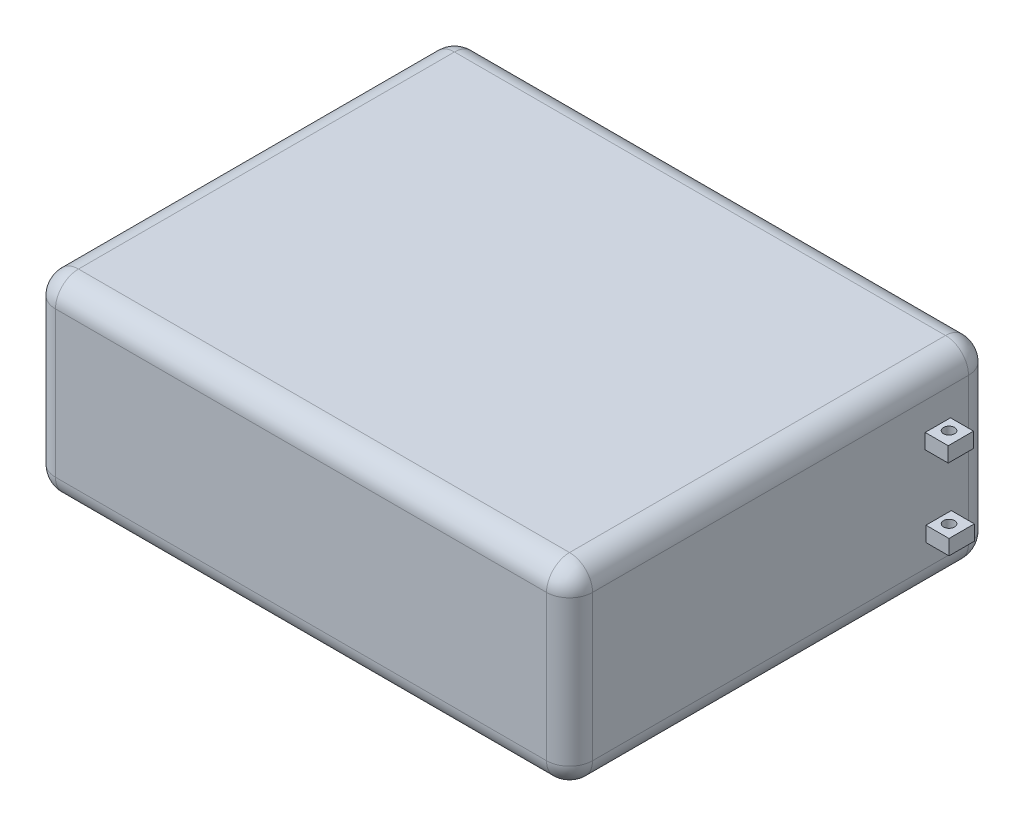
ISO-10303-21;
HEADER;
FILE_DESCRIPTION(('STEP AP214'),'2;1');
FILE_NAME('part.step','',(''),(''),'','','');
FILE_SCHEMA(('AUTOMOTIVE_DESIGN { 1 0 10303 214 1 1 1 1 }'));
ENDSEC;
DATA;
#1=APPLICATION_CONTEXT('core data for automotive mechanical design processes');
#2=APPLICATION_PROTOCOL_DEFINITION('international standard','automotive_design',2000,#1);
#3=PRODUCT_CONTEXT('',#1,'mechanical');
#4=PRODUCT('Part','Part','',(#3));
#5=PRODUCT_RELATED_PRODUCT_CATEGORY('part','',(#4));
#6=PRODUCT_DEFINITION_FORMATION('','',#4);
#7=PRODUCT_DEFINITION_CONTEXT('part definition',#1,'design');
#8=PRODUCT_DEFINITION('design','',#6,#7);
#9=PRODUCT_DEFINITION_SHAPE('','',#8);
#10=(LENGTH_UNIT() NAMED_UNIT(*) SI_UNIT(.MILLI.,.METRE.));
#11=(NAMED_UNIT(*) PLANE_ANGLE_UNIT() SI_UNIT($,.RADIAN.));
#12=(NAMED_UNIT(*) SI_UNIT($,.STERADIAN.) SOLID_ANGLE_UNIT());
#13=UNCERTAINTY_MEASURE_WITH_UNIT(LENGTH_MEASURE(1.E-05),#10,'distance_accuracy_value','');
#14=(GEOMETRIC_REPRESENTATION_CONTEXT(3) GLOBAL_UNCERTAINTY_ASSIGNED_CONTEXT((#13)) GLOBAL_UNIT_ASSIGNED_CONTEXT((#10,
#11,#12)) REPRESENTATION_CONTEXT('',''));
#15=CARTESIAN_POINT('',(0.,0.,0.));
#16=DIRECTION('',(0.,0.,1.));
#17=DIRECTION('',(1.,0.,0.));
#18=AXIS2_PLACEMENT_3D('',#15,#16,#17);
#19=CARTESIAN_POINT('',(35.,25.,-27.5));
#20=DIRECTION('',(-1.,0.,0.));
#21=DIRECTION('',(0.,0.,1.));
#22=AXIS2_PLACEMENT_3D('',#19,#20,#21);
#23=PLANE('',#22);
#24=DIRECTION('',(0.,1.,0.));
#25=VECTOR('',#24,1.);
#26=CARTESIAN_POINT('',(35.,18.3797730421074,-22.1523028209212));
#27=LINE('',#26,#25);
#28=CARTESIAN_POINT('',(35.,16.4198486947383,-22.1523028209212));
#29=VERTEX_POINT('',#28);
#30=CARTESIAN_POINT('',(35.,18.3797730421074,-22.1523028209213));
#31=VERTEX_POINT('',#30);
#32=EDGE_CURVE('E197',#29,#31,#27,.T.);
#33=ORIENTED_EDGE('',*,*,#32,.F.);
#34=DIRECTION('',(0.,0.,-1.));
#35=VECTOR('',#34,1.);
#36=CARTESIAN_POINT('',(35.,16.4198486947383,-18.8513776042997));
#37=LINE('',#36,#35);
#38=CARTESIAN_POINT('',(35.,16.4198486947383,-18.8513776042997));
#39=VERTEX_POINT('',#38);
#40=EDGE_CURVE('E210',#39,#29,#37,.T.);
#41=ORIENTED_EDGE('',*,*,#40,.F.);
#42=DIRECTION('',(0.,-1.,0.));
#43=VECTOR('',#42,1.);
#44=CARTESIAN_POINT('',(35.,18.3797730421074,-18.8513776042997));
#45=LINE('',#44,#43);
#46=CARTESIAN_POINT('',(35.,18.3797730421074,-18.8513776042997));
#47=VERTEX_POINT('',#46);
#48=EDGE_CURVE('E219',#47,#39,#45,.T.);
#49=ORIENTED_EDGE('',*,*,#48,.F.);
#50=DIRECTION('',(0.,0.,1.));
#51=VECTOR('',#50,1.);
#52=CARTESIAN_POINT('',(35.,18.3797730421074,-18.8513776042997));
#53=LINE('',#52,#51);
#54=EDGE_CURVE('E200',#31,#47,#53,.T.);
#55=ORIENTED_EDGE('',*,*,#54,.F.);
#56=EDGE_LOOP('',(#33,#41,#49,#55));
#57=FACE_BOUND('',#56,.T.);
#58=DIRECTION('',(0.,0.,-1.));
#59=VECTOR('',#58,1.);
#60=CARTESIAN_POINT('',(35.,22.,27.5));
#61=LINE('',#60,#59);
#62=CARTESIAN_POINT('',(35.,22.,-24.5));
#63=VERTEX_POINT('',#62);
#64=CARTESIAN_POINT('',(35.,22.,24.5));
#65=VERTEX_POINT('',#64);
#66=EDGE_CURVE('E259',#63,#65,#61,.F.);
#67=ORIENTED_EDGE('',*,*,#66,.T.);
#68=DIRECTION('',(0.,-1.,0.));
#69=VECTOR('',#68,1.);
#70=CARTESIAN_POINT('',(35.,25.,24.5));
#71=LINE('',#70,#69);
#72=CARTESIAN_POINT('',(35.,3.,24.5));
#73=VERTEX_POINT('',#72);
#74=EDGE_CURVE('E261',#65,#73,#71,.T.);
#75=ORIENTED_EDGE('',*,*,#74,.T.);
#76=DIRECTION('',(0.,0.,-1.));
#77=VECTOR('',#76,1.);
#78=CARTESIAN_POINT('',(35.,3.,-27.5));
#79=LINE('',#78,#77);
#80=CARTESIAN_POINT('',(35.,3.,-24.5));
#81=VERTEX_POINT('',#80);
#82=EDGE_CURVE('E255',#73,#81,#79,.T.);
#83=ORIENTED_EDGE('',*,*,#82,.T.);
#84=DIRECTION('',(0.,-1.,0.));
#85=VECTOR('',#84,1.);
#86=CARTESIAN_POINT('',(35.,25.,-24.5));
#87=LINE('',#86,#85);
#88=EDGE_CURVE('E257',#81,#63,#87,.F.);
#89=ORIENTED_EDGE('',*,*,#88,.T.);
#90=EDGE_LOOP('',(#67,#75,#83,#89));
#91=FACE_BOUND('',#90,.T.);
#92=DIRECTION('',(0.,1.,0.));
#93=VECTOR('',#92,1.);
#94=CARTESIAN_POINT('',(35.,7.85807391412618,-22.2554567339407));
#95=LINE('',#94,#93);
#96=CARTESIAN_POINT('',(35.,5.89814956675713,-22.2554567339407));
#97=VERTEX_POINT('',#96);
#98=CARTESIAN_POINT('',(35.,7.85807391412618,-22.2554567339407));
#99=VERTEX_POINT('',#98);
#100=EDGE_CURVE('E196',#97,#99,#95,.T.);
#101=ORIENTED_EDGE('',*,*,#100,.F.);
#102=DIRECTION('',(0.,0.,-1.));
#103=VECTOR('',#102,1.);
#104=CARTESIAN_POINT('',(35.,5.89814956675713,-18.9545315173191));
#105=LINE('',#104,#103);
#106=CARTESIAN_POINT('',(35.,5.89814956675713,-18.9545315173191));
#107=VERTEX_POINT('',#106);
#108=EDGE_CURVE('E193',#107,#97,#105,.T.);
#109=ORIENTED_EDGE('',*,*,#108,.F.);
#110=DIRECTION('',(0.,-1.,0.));
#111=VECTOR('',#110,1.);
#112=CARTESIAN_POINT('',(35.,7.85807391412618,-18.9545315173191));
#113=LINE('',#112,#111);
#114=CARTESIAN_POINT('',(35.,7.85807391412618,-18.9545315173191));
#115=VERTEX_POINT('',#114);
#116=EDGE_CURVE('E59',#115,#107,#113,.T.);
#117=ORIENTED_EDGE('',*,*,#116,.F.);
#118=DIRECTION('',(0.,0.,1.));
#119=VECTOR('',#118,1.);
#120=CARTESIAN_POINT('',(35.,7.85807391412618,-18.9545315173191));
#121=LINE('',#120,#119);
#122=EDGE_CURVE('E54',#99,#115,#121,.T.);
#123=ORIENTED_EDGE('',*,*,#122,.F.);
#124=EDGE_LOOP('',(#101,#109,#117,#123));
#125=FACE_BOUND('',#124,.T.);
#126=ADVANCED_FACE('F37',(#57,#91,#125),#23,.F.);
#127=CARTESIAN_POINT('',(-35.,25.,-27.5));
#128=DIRECTION('',(0.,0.,1.));
#129=DIRECTION('',(1.,0.,0.));
#130=AXIS2_PLACEMENT_3D('',#127,#128,#129);
#131=PLANE('',#130);
#132=DIRECTION('',(-1.,0.,0.));
#133=VECTOR('',#132,1.);
#134=CARTESIAN_POINT('',(35.,22.,-27.5));
#135=LINE('',#134,#133);
#136=CARTESIAN_POINT('',(-32.,22.,-27.5));
#137=VERTEX_POINT('',#136);
#138=CARTESIAN_POINT('',(32.,22.,-27.5));
#139=VERTEX_POINT('',#138);
#140=EDGE_CURVE('E268',#137,#139,#135,.F.);
#141=ORIENTED_EDGE('',*,*,#140,.T.);
#142=DIRECTION('',(0.,-1.,0.));
#143=VECTOR('',#142,1.);
#144=CARTESIAN_POINT('',(32.,25.,-27.5));
#145=LINE('',#144,#143);
#146=CARTESIAN_POINT('',(32.,3.,-27.5));
#147=VERTEX_POINT('',#146);
#148=EDGE_CURVE('E270',#139,#147,#145,.T.);
#149=ORIENTED_EDGE('',*,*,#148,.T.);
#150=DIRECTION('',(-1.,0.,0.));
#151=VECTOR('',#150,1.);
#152=CARTESIAN_POINT('',(-35.,3.,-27.5));
#153=LINE('',#152,#151);
#154=CARTESIAN_POINT('',(-32.,3.,-27.5));
#155=VERTEX_POINT('',#154);
#156=EDGE_CURVE('E264',#147,#155,#153,.T.);
#157=ORIENTED_EDGE('',*,*,#156,.T.);
#158=DIRECTION('',(0.,-1.,0.));
#159=VECTOR('',#158,1.);
#160=CARTESIAN_POINT('',(-32.,25.,-27.5));
#161=LINE('',#160,#159);
#162=EDGE_CURVE('E266',#155,#137,#161,.F.);
#163=ORIENTED_EDGE('',*,*,#162,.T.);
#164=EDGE_LOOP('',(#141,#149,#157,#163));
#165=FACE_BOUND('',#164,.T.);
#166=ADVANCED_FACE('F395',(#165),#131,.F.);
#167=CARTESIAN_POINT('',(-35.,25.,-27.5));
#168=DIRECTION('',(1.,0.,0.));
#169=DIRECTION('',(0.,0.,-1.));
#170=AXIS2_PLACEMENT_3D('',#167,#168,#169);
#171=PLANE('',#170);
#172=DIRECTION('',(0.,0.,1.));
#173=VECTOR('',#172,1.);
#174=CARTESIAN_POINT('',(-35.,22.,-27.5));
#175=LINE('',#174,#173);
#176=CARTESIAN_POINT('',(-35.,22.,24.5));
#177=VERTEX_POINT('',#176);
#178=CARTESIAN_POINT('',(-35.,22.,-24.5));
#179=VERTEX_POINT('',#178);
#180=EDGE_CURVE('E277',#177,#179,#175,.F.);
#181=ORIENTED_EDGE('',*,*,#180,.T.);
#182=DIRECTION('',(0.,-1.,0.));
#183=VECTOR('',#182,1.);
#184=CARTESIAN_POINT('',(-35.,25.,-24.5));
#185=LINE('',#184,#183);
#186=CARTESIAN_POINT('',(-35.,3.,-24.5));
#187=VERTEX_POINT('',#186);
#188=EDGE_CURVE('E279',#179,#187,#185,.T.);
#189=ORIENTED_EDGE('',*,*,#188,.T.);
#190=DIRECTION('',(0.,0.,1.));
#191=VECTOR('',#190,1.);
#192=CARTESIAN_POINT('',(-35.,3.,-27.5));
#193=LINE('',#192,#191);
#194=CARTESIAN_POINT('',(-35.,3.,24.5));
#195=VERTEX_POINT('',#194);
#196=EDGE_CURVE('E273',#187,#195,#193,.T.);
#197=ORIENTED_EDGE('',*,*,#196,.T.);
#198=DIRECTION('',(0.,-1.,0.));
#199=VECTOR('',#198,1.);
#200=CARTESIAN_POINT('',(-35.,25.,24.5));
#201=LINE('',#200,#199);
#202=EDGE_CURVE('E275',#195,#177,#201,.F.);
#203=ORIENTED_EDGE('',*,*,#202,.T.);
#204=EDGE_LOOP('',(#181,#189,#197,#203));
#205=FACE_BOUND('',#204,.T.);
#206=ADVANCED_FACE('F367',(#205),#171,.F.);
#207=CARTESIAN_POINT('',(-35.,25.,27.5));
#208=DIRECTION('',(0.,0.,-1.));
#209=DIRECTION('',(-1.,0.,0.));
#210=AXIS2_PLACEMENT_3D('',#207,#208,#209);
#211=PLANE('',#210);
#212=DIRECTION('',(0.,-1.,0.));
#213=VECTOR('',#212,1.);
#214=CARTESIAN_POINT('',(32.,25.,27.5));
#215=LINE('',#214,#213);
#216=CARTESIAN_POINT('',(32.,3.,27.5));
#217=VERTEX_POINT('',#216);
#218=CARTESIAN_POINT('',(32.,22.,27.5));
#219=VERTEX_POINT('',#218);
#220=EDGE_CURVE('E250',#217,#219,#215,.F.);
#221=ORIENTED_EDGE('',*,*,#220,.T.);
#222=DIRECTION('',(1.,0.,0.));
#223=VECTOR('',#222,1.);
#224=CARTESIAN_POINT('',(-35.,22.,27.5));
#225=LINE('',#224,#223);
#226=CARTESIAN_POINT('',(-32.,22.,27.5));
#227=VERTEX_POINT('',#226);
#228=EDGE_CURVE('E252',#219,#227,#225,.F.);
#229=ORIENTED_EDGE('',*,*,#228,.T.);
#230=DIRECTION('',(0.,-1.,0.));
#231=VECTOR('',#230,1.);
#232=CARTESIAN_POINT('',(-32.,25.,27.5));
#233=LINE('',#232,#231);
#234=CARTESIAN_POINT('',(-32.,3.,27.5));
#235=VERTEX_POINT('',#234);
#236=EDGE_CURVE('E248',#227,#235,#233,.T.);
#237=ORIENTED_EDGE('',*,*,#236,.T.);
#238=DIRECTION('',(1.,0.,0.));
#239=VECTOR('',#238,1.);
#240=CARTESIAN_POINT('',(-35.,3.,27.5));
#241=LINE('',#240,#239);
#242=EDGE_CURVE('E246',#235,#217,#241,.T.);
#243=ORIENTED_EDGE('',*,*,#242,.T.);
#244=EDGE_LOOP('',(#221,#229,#237,#243));
#245=FACE_BOUND('',#244,.T.);
#246=ADVANCED_FACE('F768',(#245),#211,.F.);
#247=CARTESIAN_POINT('',(0.,25.,0.));
#248=DIRECTION('',(0.,1.,0.));
#249=DIRECTION('',(0.,0.,1.));
#250=AXIS2_PLACEMENT_3D('',#247,#248,#249);
#251=PLANE('',#250);
#252=DIRECTION('',(0.,0.,1.));
#253=VECTOR('',#252,1.);
#254=CARTESIAN_POINT('',(-32.,25.,27.5));
#255=LINE('',#254,#253);
#256=CARTESIAN_POINT('',(-32.,25.,-24.5));
#257=VERTEX_POINT('',#256);
#258=CARTESIAN_POINT('',(-32.,25.,24.5));
#259=VERTEX_POINT('',#258);
#260=EDGE_CURVE('E236',#257,#259,#255,.T.);
#261=ORIENTED_EDGE('',*,*,#260,.T.);
#262=DIRECTION('',(1.,0.,0.));
#263=VECTOR('',#262,1.);
#264=CARTESIAN_POINT('',(35.,25.,24.5));
#265=LINE('',#264,#263);
#266=CARTESIAN_POINT('',(32.,25.,24.5));
#267=VERTEX_POINT('',#266);
#268=EDGE_CURVE('E243',#259,#267,#265,.T.);
#269=ORIENTED_EDGE('',*,*,#268,.T.);
#270=DIRECTION('',(0.,0.,-1.));
#271=VECTOR('',#270,1.);
#272=CARTESIAN_POINT('',(32.,25.,-27.5));
#273=LINE('',#272,#271);
#274=CARTESIAN_POINT('',(32.,25.,-24.5));
#275=VERTEX_POINT('',#274);
#276=EDGE_CURVE('E241',#267,#275,#273,.T.);
#277=ORIENTED_EDGE('',*,*,#276,.T.);
#278=DIRECTION('',(-1.,0.,0.));
#279=VECTOR('',#278,1.);
#280=CARTESIAN_POINT('',(-35.,25.,-24.5));
#281=LINE('',#280,#279);
#282=EDGE_CURVE('E238',#275,#257,#281,.T.);
#283=ORIENTED_EDGE('',*,*,#282,.T.);
#284=EDGE_LOOP('',(#261,#269,#277,#283));
#285=FACE_BOUND('',#284,.T.);
#286=ADVANCED_FACE('F385',(#285),#251,.T.);
#287=CARTESIAN_POINT('',(0.,0.,0.));
#288=DIRECTION('',(0.,1.,0.));
#289=DIRECTION('',(0.,0.,1.));
#290=AXIS2_PLACEMENT_3D('',#287,#288,#289);
#291=PLANE('',#290);
#292=DIRECTION('',(0.,0.,1.));
#293=VECTOR('',#292,1.);
#294=CARTESIAN_POINT('',(-32.,0.,0.));
#295=LINE('',#294,#293);
#296=CARTESIAN_POINT('',(-32.,0.,24.5));
#297=VERTEX_POINT('',#296);
#298=CARTESIAN_POINT('',(-32.,0.,-24.5));
#299=VERTEX_POINT('',#298);
#300=EDGE_CURVE('E46',#297,#299,#295,.F.);
#301=ORIENTED_EDGE('',*,*,#300,.T.);
#302=DIRECTION('',(-1.,0.,0.));
#303=VECTOR('',#302,1.);
#304=CARTESIAN_POINT('',(0.,0.,-24.5));
#305=LINE('',#304,#303);
#306=CARTESIAN_POINT('',(32.,0.,-24.5));
#307=VERTEX_POINT('',#306);
#308=EDGE_CURVE('E11',#299,#307,#305,.F.);
#309=ORIENTED_EDGE('',*,*,#308,.T.);
#310=DIRECTION('',(0.,0.,-1.));
#311=VECTOR('',#310,1.);
#312=CARTESIAN_POINT('',(32.,0.,0.));
#313=LINE('',#312,#311);
#314=CARTESIAN_POINT('',(32.,0.,24.5));
#315=VERTEX_POINT('',#314);
#316=EDGE_CURVE('E282',#307,#315,#313,.F.);
#317=ORIENTED_EDGE('',*,*,#316,.T.);
#318=DIRECTION('',(1.,0.,0.));
#319=VECTOR('',#318,1.);
#320=CARTESIAN_POINT('',(0.,0.,24.5));
#321=LINE('',#320,#319);
#322=EDGE_CURVE('E284',#315,#297,#321,.F.);
#323=ORIENTED_EDGE('',*,*,#322,.T.);
#324=EDGE_LOOP('',(#301,#309,#317,#323));
#325=FACE_BOUND('',#324,.T.);
#326=ADVANCED_FACE('F407',(#325),#291,.F.);
#327=CARTESIAN_POINT('',(-35.,3.,-24.5));
#328=DIRECTION('',(-1.,0.,0.));
#329=DIRECTION('',(0.,0.,1.));
#330=AXIS2_PLACEMENT_3D('',#327,#328,#329);
#331=CYLINDRICAL_SURFACE('',#330,3.);
#332=CARTESIAN_POINT('',(-32.,3.,-24.5));
#333=DIRECTION('',(-1.,0.,0.));
#334=DIRECTION('',(0.,0.,1.));
#335=AXIS2_PLACEMENT_3D('',#332,#333,#334);
#336=CIRCLE('',#335,3.);
#337=EDGE_CURVE('E239',#155,#299,#336,.T.);
#338=ORIENTED_EDGE('',*,*,#337,.F.);
#339=ORIENTED_EDGE('',*,*,#156,.F.);
#340=CARTESIAN_POINT('',(32.,3.,-24.5));
#341=DIRECTION('',(1.,0.,0.));
#342=DIRECTION('',(0.,0.,-1.));
#343=AXIS2_PLACEMENT_3D('',#340,#341,#342);
#344=CIRCLE('',#343,3.);
#345=EDGE_CURVE('E348',#307,#147,#344,.T.);
#346=ORIENTED_EDGE('',*,*,#345,.F.);
#347=ORIENTED_EDGE('',*,*,#308,.F.);
#348=EDGE_LOOP('',(#338,#339,#346,#347));
#349=FACE_BOUND('',#348,.T.);
#350=ADVANCED_FACE('F39',(#349),#331,.T.);
#351=CARTESIAN_POINT('',(-32.,3.,-24.5));
#352=DIRECTION('',(0.,-1.,0.));
#353=DIRECTION('',(0.,0.,-1.));
#354=AXIS2_PLACEMENT_3D('',#351,#352,#353);
#355=SPHERICAL_SURFACE('',#354,3.);
#356=CARTESIAN_POINT('',(-32.,3.,-24.5));
#357=DIRECTION('',(0.,-1.,0.));
#358=DIRECTION('',(0.,0.,-1.));
#359=AXIS2_PLACEMENT_3D('',#356,#357,#358);
#360=CIRCLE('',#359,3.);
#361=EDGE_CURVE('E342',#155,#187,#360,.F.);
#362=ORIENTED_EDGE('',*,*,#361,.F.);
#363=ORIENTED_EDGE('',*,*,#337,.T.);
#364=CARTESIAN_POINT('',(-32.,3.,-24.5));
#365=DIRECTION('',(0.,0.,-1.));
#366=DIRECTION('',(-1.,0.,0.));
#367=AXIS2_PLACEMENT_3D('',#364,#365,#366);
#368=CIRCLE('',#367,3.);
#369=EDGE_CURVE('E345',#187,#299,#368,.F.);
#370=ORIENTED_EDGE('',*,*,#369,.F.);
#371=EDGE_LOOP('',(#362,#363,#370));
#372=FACE_BOUND('',#371,.T.);
#373=ADVANCED_FACE('F355',(#372),#355,.T.);
#374=CARTESIAN_POINT('',(32.,3.,-24.5));
#375=DIRECTION('',(0.,0.,-1.));
#376=DIRECTION('',(0.,1.,0.));
#377=AXIS2_PLACEMENT_3D('',#374,#375,#376);
#378=SPHERICAL_SURFACE('',#377,3.);
#379=CARTESIAN_POINT('',(32.,3.,-24.5));
#380=DIRECTION('',(0.,0.,-1.));
#381=DIRECTION('',(-1.,0.,0.));
#382=AXIS2_PLACEMENT_3D('',#379,#380,#381);
#383=CIRCLE('',#382,3.);
#384=EDGE_CURVE('E337',#307,#81,#383,.F.);
#385=ORIENTED_EDGE('',*,*,#384,.F.);
#386=ORIENTED_EDGE('',*,*,#345,.T.);
#387=CARTESIAN_POINT('',(32.,3.,-24.5));
#388=DIRECTION('',(0.,-1.,0.));
#389=DIRECTION('',(0.,0.,-1.));
#390=AXIS2_PLACEMENT_3D('',#387,#388,#389);
#391=CIRCLE('',#390,3.);
#392=EDGE_CURVE('E340',#81,#147,#391,.F.);
#393=ORIENTED_EDGE('',*,*,#392,.F.);
#394=EDGE_LOOP('',(#385,#386,#393));
#395=FACE_BOUND('',#394,.T.);
#396=ADVANCED_FACE('F405',(#395),#378,.T.);
#397=CARTESIAN_POINT('',(-32.,3.,-27.5));
#398=DIRECTION('',(0.,0.,1.));
#399=DIRECTION('',(1.,0.,0.));
#400=AXIS2_PLACEMENT_3D('',#397,#398,#399);
#401=CYLINDRICAL_SURFACE('',#400,3.);
#402=ORIENTED_EDGE('',*,*,#369,.T.);
#403=ORIENTED_EDGE('',*,*,#300,.F.);
#404=CARTESIAN_POINT('',(-32.,3.,24.5));
#405=DIRECTION('',(0.,0.,1.));
#406=DIRECTION('',(1.,0.,0.));
#407=AXIS2_PLACEMENT_3D('',#404,#405,#406);
#408=CIRCLE('',#407,3.);
#409=EDGE_CURVE('E331',#195,#297,#408,.T.);
#410=ORIENTED_EDGE('',*,*,#409,.F.);
#411=ORIENTED_EDGE('',*,*,#196,.F.);
#412=EDGE_LOOP('',(#402,#403,#410,#411));
#413=FACE_BOUND('',#412,.T.);
#414=ADVANCED_FACE('F362',(#413),#401,.T.);
#415=CARTESIAN_POINT('',(-32.,25.,-24.5));
#416=DIRECTION('',(0.,-1.,0.));
#417=DIRECTION('',(0.,0.,-1.));
#418=AXIS2_PLACEMENT_3D('',#415,#416,#417);
#419=CYLINDRICAL_SURFACE('',#418,3.);
#420=ORIENTED_EDGE('',*,*,#361,.T.);
#421=ORIENTED_EDGE('',*,*,#188,.F.);
#422=CARTESIAN_POINT('',(-32.,22.,-24.5));
#423=DIRECTION('',(0.,1.,0.));
#424=DIRECTION('',(0.,0.,1.));
#425=AXIS2_PLACEMENT_3D('',#422,#423,#424);
#426=CIRCLE('',#425,3.);
#427=EDGE_CURVE('E328',#137,#179,#426,.T.);
#428=ORIENTED_EDGE('',*,*,#427,.F.);
#429=ORIENTED_EDGE('',*,*,#162,.F.);
#430=EDGE_LOOP('',(#420,#421,#428,#429));
#431=FACE_BOUND('',#430,.T.);
#432=ADVANCED_FACE('F373',(#431),#419,.T.);
#433=CARTESIAN_POINT('',(0.,22.,-24.5));
#434=DIRECTION('',(1.,0.,0.));
#435=DIRECTION('',(0.,0.,-1.));
#436=AXIS2_PLACEMENT_3D('',#433,#434,#435);
#437=CYLINDRICAL_SURFACE('',#436,3.);
#438=CARTESIAN_POINT('',(32.,22.,-24.5));
#439=DIRECTION('',(1.,0.,0.));
#440=DIRECTION('',(0.,0.,-1.));
#441=AXIS2_PLACEMENT_3D('',#438,#439,#440);
#442=CIRCLE('',#441,3.);
#443=EDGE_CURVE('E322',#139,#275,#442,.T.);
#444=ORIENTED_EDGE('',*,*,#443,.F.);
#445=ORIENTED_EDGE('',*,*,#140,.F.);
#446=CARTESIAN_POINT('',(-32.,22.,-24.5));
#447=DIRECTION('',(-1.,0.,0.));
#448=DIRECTION('',(0.,0.,1.));
#449=AXIS2_PLACEMENT_3D('',#446,#447,#448);
#450=CIRCLE('',#449,3.);
#451=EDGE_CURVE('E325',#257,#137,#450,.T.);
#452=ORIENTED_EDGE('',*,*,#451,.F.);
#453=ORIENTED_EDGE('',*,*,#282,.F.);
#454=EDGE_LOOP('',(#444,#445,#452,#453));
#455=FACE_BOUND('',#454,.T.);
#456=ADVANCED_FACE('F392',(#455),#437,.T.);
#457=CARTESIAN_POINT('',(32.,25.,-24.5));
#458=DIRECTION('',(0.,-1.,0.));
#459=DIRECTION('',(0.,0.,-1.));
#460=AXIS2_PLACEMENT_3D('',#457,#458,#459);
#461=CYLINDRICAL_SURFACE('',#460,3.);
#462=ORIENTED_EDGE('',*,*,#392,.T.);
#463=ORIENTED_EDGE('',*,*,#148,.F.);
#464=CARTESIAN_POINT('',(32.,22.,-24.5));
#465=DIRECTION('',(0.,1.,0.));
#466=DIRECTION('',(0.,0.,1.));
#467=AXIS2_PLACEMENT_3D('',#464,#465,#466);
#468=CIRCLE('',#467,3.);
#469=EDGE_CURVE('E319',#63,#139,#468,.T.);
#470=ORIENTED_EDGE('',*,*,#469,.F.);
#471=ORIENTED_EDGE('',*,*,#88,.F.);
#472=EDGE_LOOP('',(#462,#463,#470,#471));
#473=FACE_BOUND('',#472,.T.);
#474=ADVANCED_FACE('F398',(#473),#461,.T.);
#475=CARTESIAN_POINT('',(32.,3.,-27.5));
#476=DIRECTION('',(0.,0.,-1.));
#477=DIRECTION('',(-1.,0.,0.));
#478=AXIS2_PLACEMENT_3D('',#475,#476,#477);
#479=CYLINDRICAL_SURFACE('',#478,3.);
#480=ORIENTED_EDGE('',*,*,#384,.T.);
#481=ORIENTED_EDGE('',*,*,#82,.F.);
#482=CARTESIAN_POINT('',(32.,3.,24.5));
#483=DIRECTION('',(0.,0.,1.));
#484=DIRECTION('',(1.,0.,0.));
#485=AXIS2_PLACEMENT_3D('',#482,#483,#484);
#486=CIRCLE('',#485,3.);
#487=EDGE_CURVE('E316',#315,#73,#486,.T.);
#488=ORIENTED_EDGE('',*,*,#487,.F.);
#489=ORIENTED_EDGE('',*,*,#316,.F.);
#490=EDGE_LOOP('',(#480,#481,#488,#489));
#491=FACE_BOUND('',#490,.T.);
#492=ADVANCED_FACE('F468',(#491),#479,.T.);
#493=CARTESIAN_POINT('',(-35.,3.,24.5));
#494=DIRECTION('',(1.,0.,0.));
#495=DIRECTION('',(0.,0.,-1.));
#496=AXIS2_PLACEMENT_3D('',#493,#494,#495);
#497=CYLINDRICAL_SURFACE('',#496,3.);
#498=CARTESIAN_POINT('',(-32.,3.,24.5));
#499=DIRECTION('',(-1.,0.,0.));
#500=DIRECTION('',(0.,0.,1.));
#501=AXIS2_PLACEMENT_3D('',#498,#499,#500);
#502=CIRCLE('',#501,3.);
#503=EDGE_CURVE('E334',#297,#235,#502,.T.);
#504=ORIENTED_EDGE('',*,*,#503,.F.);
#505=ORIENTED_EDGE('',*,*,#322,.F.);
#506=CARTESIAN_POINT('',(32.,3.,24.5));
#507=DIRECTION('',(1.,0.,0.));
#508=DIRECTION('',(0.,0.,-1.));
#509=AXIS2_PLACEMENT_3D('',#506,#507,#508);
#510=CIRCLE('',#509,3.);
#511=EDGE_CURVE('E313',#217,#315,#510,.T.);
#512=ORIENTED_EDGE('',*,*,#511,.F.);
#513=ORIENTED_EDGE('',*,*,#242,.F.);
#514=EDGE_LOOP('',(#504,#505,#512,#513));
#515=FACE_BOUND('',#514,.T.);
#516=ADVANCED_FACE('F464',(#515),#497,.T.);
#517=CARTESIAN_POINT('',(-32.,3.,24.5));
#518=DIRECTION('',(0.,-1.,0.));
#519=DIRECTION('',(0.,0.,-1.));
#520=AXIS2_PLACEMENT_3D('',#517,#518,#519);
#521=SPHERICAL_SURFACE('',#520,3.);
#522=ORIENTED_EDGE('',*,*,#409,.T.);
#523=ORIENTED_EDGE('',*,*,#503,.T.);
#524=CARTESIAN_POINT('',(-32.,3.,24.5));
#525=DIRECTION('',(0.,-1.,0.));
#526=DIRECTION('',(0.,0.,-1.));
#527=AXIS2_PLACEMENT_3D('',#524,#525,#526);
#528=CIRCLE('',#527,3.);
#529=EDGE_CURVE('E310',#195,#235,#528,.F.);
#530=ORIENTED_EDGE('',*,*,#529,.F.);
#531=EDGE_LOOP('',(#522,#523,#530));
#532=FACE_BOUND('',#531,.T.);
#533=ADVANCED_FACE('F461',(#532),#521,.T.);
#534=CARTESIAN_POINT('',(-32.,22.,-24.5));
#535=DIRECTION('',(0.,0.,-1.));
#536=DIRECTION('',(-1.,0.,0.));
#537=AXIS2_PLACEMENT_3D('',#534,#535,#536);
#538=SPHERICAL_SURFACE('',#537,3.);
#539=ORIENTED_EDGE('',*,*,#451,.T.);
#540=ORIENTED_EDGE('',*,*,#427,.T.);
#541=CARTESIAN_POINT('',(-32.,22.,-24.5));
#542=DIRECTION('',(0.,0.,-1.));
#543=DIRECTION('',(-1.,0.,0.));
#544=AXIS2_PLACEMENT_3D('',#541,#542,#543);
#545=CIRCLE('',#544,3.);
#546=EDGE_CURVE('E307',#257,#179,#545,.F.);
#547=ORIENTED_EDGE('',*,*,#546,.F.);
#548=EDGE_LOOP('',(#539,#540,#547));
#549=FACE_BOUND('',#548,.T.);
#550=ADVANCED_FACE('F376',(#549),#538,.T.);
#551=CARTESIAN_POINT('',(32.,22.,-24.5));
#552=DIRECTION('',(0.,0.,-1.));
#553=DIRECTION('',(-1.,0.,0.));
#554=AXIS2_PLACEMENT_3D('',#551,#552,#553);
#555=SPHERICAL_SURFACE('',#554,3.);
#556=ORIENTED_EDGE('',*,*,#469,.T.);
#557=ORIENTED_EDGE('',*,*,#443,.T.);
#558=CARTESIAN_POINT('',(32.,22.,-24.5));
#559=DIRECTION('',(0.,0.,-1.));
#560=DIRECTION('',(-1.,0.,0.));
#561=AXIS2_PLACEMENT_3D('',#558,#559,#560);
#562=CIRCLE('',#561,3.);
#563=EDGE_CURVE('E304',#63,#275,#562,.F.);
#564=ORIENTED_EDGE('',*,*,#563,.F.);
#565=EDGE_LOOP('',(#556,#557,#564));
#566=FACE_BOUND('',#565,.T.);
#567=ADVANCED_FACE('F454',(#566),#555,.T.);
#568=CARTESIAN_POINT('',(32.,3.,24.5));
#569=DIRECTION('',(0.,-1.,0.));
#570=DIRECTION('',(0.,0.,-1.));
#571=AXIS2_PLACEMENT_3D('',#568,#569,#570);
#572=SPHERICAL_SURFACE('',#571,3.);
#573=ORIENTED_EDGE('',*,*,#511,.T.);
#574=ORIENTED_EDGE('',*,*,#487,.T.);
#575=CARTESIAN_POINT('',(32.,3.,24.5));
#576=DIRECTION('',(0.,-1.,0.));
#577=DIRECTION('',(0.,0.,-1.));
#578=AXIS2_PLACEMENT_3D('',#575,#576,#577);
#579=CIRCLE('',#578,3.);
#580=EDGE_CURVE('E302',#217,#73,#579,.F.);
#581=ORIENTED_EDGE('',*,*,#580,.F.);
#582=EDGE_LOOP('',(#573,#574,#581));
#583=FACE_BOUND('',#582,.T.);
#584=ADVANCED_FACE('F450',(#583),#572,.T.);
#585=CARTESIAN_POINT('',(-32.,25.,24.5));
#586=DIRECTION('',(0.,-1.,0.));
#587=DIRECTION('',(0.,0.,-1.));
#588=AXIS2_PLACEMENT_3D('',#585,#586,#587);
#589=CYLINDRICAL_SURFACE('',#588,3.);
#590=ORIENTED_EDGE('',*,*,#529,.T.);
#591=ORIENTED_EDGE('',*,*,#236,.F.);
#592=CARTESIAN_POINT('',(-32.,22.,24.5));
#593=DIRECTION('',(0.,1.,0.));
#594=DIRECTION('',(0.,0.,1.));
#595=AXIS2_PLACEMENT_3D('',#592,#593,#594);
#596=CIRCLE('',#595,3.);
#597=EDGE_CURVE('E299',#177,#227,#596,.T.);
#598=ORIENTED_EDGE('',*,*,#597,.F.);
#599=ORIENTED_EDGE('',*,*,#202,.F.);
#600=EDGE_LOOP('',(#590,#591,#598,#599));
#601=FACE_BOUND('',#600,.T.);
#602=ADVANCED_FACE('F447',(#601),#589,.T.);
#603=CARTESIAN_POINT('',(-32.,22.,0.));
#604=DIRECTION('',(0.,0.,-1.));
#605=DIRECTION('',(-1.,0.,0.));
#606=AXIS2_PLACEMENT_3D('',#603,#604,#605);
#607=CYLINDRICAL_SURFACE('',#606,3.);
#608=ORIENTED_EDGE('',*,*,#546,.T.);
#609=ORIENTED_EDGE('',*,*,#180,.F.);
#610=CARTESIAN_POINT('',(-32.,22.,24.5));
#611=DIRECTION('',(0.,0.,1.));
#612=DIRECTION('',(1.,0.,0.));
#613=AXIS2_PLACEMENT_3D('',#610,#611,#612);
#614=CIRCLE('',#613,3.);
#615=EDGE_CURVE('E296',#259,#177,#614,.T.);
#616=ORIENTED_EDGE('',*,*,#615,.F.);
#617=ORIENTED_EDGE('',*,*,#260,.F.);
#618=EDGE_LOOP('',(#608,#609,#616,#617));
#619=FACE_BOUND('',#618,.T.);
#620=ADVANCED_FACE('F380',(#619),#607,.T.);
#621=CARTESIAN_POINT('',(32.,22.,0.));
#622=DIRECTION('',(0.,0.,1.));
#623=DIRECTION('',(1.,0.,0.));
#624=AXIS2_PLACEMENT_3D('',#621,#622,#623);
#625=CYLINDRICAL_SURFACE('',#624,3.);
#626=ORIENTED_EDGE('',*,*,#563,.T.);
#627=ORIENTED_EDGE('',*,*,#276,.F.);
#628=CARTESIAN_POINT('',(32.,22.,24.5));
#629=DIRECTION('',(0.,0.,1.));
#630=DIRECTION('',(0.,-1.,0.));
#631=AXIS2_PLACEMENT_3D('',#628,#629,#630);
#632=CIRCLE('',#631,3.);
#633=EDGE_CURVE('E293',#65,#267,#632,.T.);
#634=ORIENTED_EDGE('',*,*,#633,.F.);
#635=ORIENTED_EDGE('',*,*,#66,.F.);
#636=EDGE_LOOP('',(#626,#627,#634,#635));
#637=FACE_BOUND('',#636,.T.);
#638=ADVANCED_FACE('F440',(#637),#625,.T.);
#639=CARTESIAN_POINT('',(32.,25.,24.5));
#640=DIRECTION('',(0.,-1.,0.));
#641=DIRECTION('',(0.,0.,-1.));
#642=AXIS2_PLACEMENT_3D('',#639,#640,#641);
#643=CYLINDRICAL_SURFACE('',#642,3.);
#644=ORIENTED_EDGE('',*,*,#580,.T.);
#645=ORIENTED_EDGE('',*,*,#74,.F.);
#646=CARTESIAN_POINT('',(32.,22.,24.5));
#647=DIRECTION('',(0.,1.,0.));
#648=DIRECTION('',(0.,0.,1.));
#649=AXIS2_PLACEMENT_3D('',#646,#647,#648);
#650=CIRCLE('',#649,3.);
#651=EDGE_CURVE('E290',#219,#65,#650,.T.);
#652=ORIENTED_EDGE('',*,*,#651,.F.);
#653=ORIENTED_EDGE('',*,*,#220,.F.);
#654=EDGE_LOOP('',(#644,#645,#652,#653));
#655=FACE_BOUND('',#654,.T.);
#656=ADVANCED_FACE('F436',(#655),#643,.T.);
#657=CARTESIAN_POINT('',(-32.,22.,24.5));
#658=DIRECTION('',(-1.,0.,0.));
#659=DIRECTION('',(0.,0.,1.));
#660=AXIS2_PLACEMENT_3D('',#657,#658,#659);
#661=SPHERICAL_SURFACE('',#660,3.);
#662=ORIENTED_EDGE('',*,*,#615,.T.);
#663=ORIENTED_EDGE('',*,*,#597,.T.);
#664=CARTESIAN_POINT('',(-32.,22.,24.5));
#665=DIRECTION('',(-1.,0.,0.));
#666=DIRECTION('',(0.,0.,1.));
#667=AXIS2_PLACEMENT_3D('',#664,#665,#666);
#668=CIRCLE('',#667,3.);
#669=EDGE_CURVE('E288',#259,#227,#668,.F.);
#670=ORIENTED_EDGE('',*,*,#669,.F.);
#671=EDGE_LOOP('',(#662,#663,#670));
#672=FACE_BOUND('',#671,.T.);
#673=ADVANCED_FACE('F432',(#672),#661,.T.);
#674=CARTESIAN_POINT('',(32.,22.,24.5));
#675=DIRECTION('',(1.,0.,0.));
#676=DIRECTION('',(0.,0.,-1.));
#677=AXIS2_PLACEMENT_3D('',#674,#675,#676);
#678=SPHERICAL_SURFACE('',#677,3.);
#679=ORIENTED_EDGE('',*,*,#651,.T.);
#680=ORIENTED_EDGE('',*,*,#633,.T.);
#681=CARTESIAN_POINT('',(32.,22.,24.5));
#682=DIRECTION('',(1.,0.,0.));
#683=DIRECTION('',(0.,0.,-1.));
#684=AXIS2_PLACEMENT_3D('',#681,#682,#683);
#685=CIRCLE('',#684,3.);
#686=EDGE_CURVE('E235',#219,#267,#685,.F.);
#687=ORIENTED_EDGE('',*,*,#686,.F.);
#688=EDGE_LOOP('',(#679,#680,#687));
#689=FACE_BOUND('',#688,.T.);
#690=ADVANCED_FACE('F428',(#689),#678,.T.);
#691=CARTESIAN_POINT('',(0.,22.,24.5));
#692=DIRECTION('',(-1.,0.,0.));
#693=DIRECTION('',(0.,0.,1.));
#694=AXIS2_PLACEMENT_3D('',#691,#692,#693);
#695=CYLINDRICAL_SURFACE('',#694,3.);
#696=ORIENTED_EDGE('',*,*,#669,.T.);
#697=ORIENTED_EDGE('',*,*,#228,.F.);
#698=ORIENTED_EDGE('',*,*,#686,.T.);
#699=ORIENTED_EDGE('',*,*,#268,.F.);
#700=EDGE_LOOP('',(#696,#697,#698,#699));
#701=FACE_BOUND('',#700,.T.);
#702=ADVANCED_FACE('F424',(#701),#695,.T.);
#703=CARTESIAN_POINT('',(38.,18.3797730421074,-22.1523028209212));
#704=DIRECTION('',(0.,0.,1.));
#705=DIRECTION('',(1.,0.,0.));
#706=AXIS2_PLACEMENT_3D('',#703,#704,#705);
#707=PLANE('',#706);
#708=ORIENTED_EDGE('',*,*,#32,.T.);
#709=DIRECTION('',(-1.,0.,0.));
#710=VECTOR('',#709,1.);
#711=CARTESIAN_POINT('',(38.,18.3797730421074,-22.1523028209212));
#712=LINE('',#711,#710);
#713=CARTESIAN_POINT('',(38.,18.3797730421074,-22.1523028209212));
#714=VERTEX_POINT('',#713);
#715=EDGE_CURVE('E232',#714,#31,#712,.T.);
#716=ORIENTED_EDGE('',*,*,#715,.F.);
#717=DIRECTION('',(0.,1.,0.));
#718=VECTOR('',#717,1.);
#719=CARTESIAN_POINT('',(38.,18.3797730421074,-22.1523028209212));
#720=LINE('',#719,#718);
#721=CARTESIAN_POINT('',(38.,16.4198486947383,-22.1523028209212));
#722=VERTEX_POINT('',#721);
#723=EDGE_CURVE('E206',#722,#714,#720,.T.);
#724=ORIENTED_EDGE('',*,*,#723,.F.);
#725=DIRECTION('',(-1.,0.,0.));
#726=VECTOR('',#725,1.);
#727=CARTESIAN_POINT('',(38.,16.4198486947383,-22.1523028209212));
#728=LINE('',#727,#726);
#729=EDGE_CURVE('E215',#722,#29,#728,.T.);
#730=ORIENTED_EDGE('',*,*,#729,.T.);
#731=EDGE_LOOP('',(#708,#716,#724,#730));
#732=FACE_BOUND('',#731,.T.);
#733=ADVANCED_FACE('F427',(#732),#707,.F.);
#734=CARTESIAN_POINT('',(38.,18.3797730421074,-18.8513776042997));
#735=DIRECTION('',(0.,-1.,0.));
#736=DIRECTION('',(0.,0.,-1.));
#737=AXIS2_PLACEMENT_3D('',#734,#735,#736);
#738=PLANE('',#737);
#739=CARTESIAN_POINT('',(36.3458468731728,18.3797730421074,-20.6134268234034));
#740=DIRECTION('',(0.,1.,0.));
#741=DIRECTION('',(0.,0.,1.));
#742=AXIS2_PLACEMENT_3D('',#739,#740,#741);
#743=CIRCLE('',#742,0.719628756135035);
#744=CARTESIAN_POINT('',(36.3458468731728,18.3797730421074,-19.8937980672684));
#745=VERTEX_POINT('',#744);
#746=EDGE_CURVE('E838',#745,#745,#743,.T.);
#747=ORIENTED_EDGE('',*,*,#746,.F.);
#748=EDGE_LOOP('',(#747));
#749=FACE_BOUND('',#748,.T.);
#750=ORIENTED_EDGE('',*,*,#54,.T.);
#751=DIRECTION('',(-1.,0.,0.));
#752=VECTOR('',#751,1.);
#753=CARTESIAN_POINT('',(38.,18.3797730421074,-18.8513776042997));
#754=LINE('',#753,#752);
#755=CARTESIAN_POINT('',(38.,18.3797730421074,-18.8513776042997));
#756=VERTEX_POINT('',#755);
#757=EDGE_CURVE('E229',#756,#47,#754,.T.);
#758=ORIENTED_EDGE('',*,*,#757,.F.);
#759=DIRECTION('',(0.,0.,1.));
#760=VECTOR('',#759,1.);
#761=CARTESIAN_POINT('',(38.,18.3797730421074,-18.8513776042997));
#762=LINE('',#761,#760);
#763=EDGE_CURVE('E209',#714,#756,#762,.T.);
#764=ORIENTED_EDGE('',*,*,#763,.F.);
#765=ORIENTED_EDGE('',*,*,#715,.T.);
#766=EDGE_LOOP('',(#750,#758,#764,#765));
#767=FACE_BOUND('',#766,.T.);
#768=ADVANCED_FACE('F560',(#749,#767),#738,.F.);
#769=CARTESIAN_POINT('',(38.,18.3797730421074,-18.8513776042997));
#770=DIRECTION('',(0.,0.,-1.));
#771=DIRECTION('',(-1.,0.,0.));
#772=AXIS2_PLACEMENT_3D('',#769,#770,#771);
#773=PLANE('',#772);
#774=ORIENTED_EDGE('',*,*,#48,.T.);
#775=DIRECTION('',(-1.,0.,0.));
#776=VECTOR('',#775,1.);
#777=CARTESIAN_POINT('',(38.,16.4198486947383,-18.8513776042997));
#778=LINE('',#777,#776);
#779=CARTESIAN_POINT('',(38.,16.4198486947383,-18.8513776042997));
#780=VERTEX_POINT('',#779);
#781=EDGE_CURVE('E226',#780,#39,#778,.T.);
#782=ORIENTED_EDGE('',*,*,#781,.F.);
#783=DIRECTION('',(0.,-1.,0.));
#784=VECTOR('',#783,1.);
#785=CARTESIAN_POINT('',(38.,18.3797730421074,-18.8513776042997));
#786=LINE('',#785,#784);
#787=EDGE_CURVE('E212',#756,#780,#786,.T.);
#788=ORIENTED_EDGE('',*,*,#787,.F.);
#789=ORIENTED_EDGE('',*,*,#757,.T.);
#790=EDGE_LOOP('',(#774,#782,#788,#789));
#791=FACE_BOUND('',#790,.T.);
#792=ADVANCED_FACE('F570',(#791),#773,.F.);
#793=CARTESIAN_POINT('',(38.,16.4198486947383,-18.8513776042997));
#794=DIRECTION('',(0.,1.,0.));
#795=DIRECTION('',(0.,0.,1.));
#796=AXIS2_PLACEMENT_3D('',#793,#794,#795);
#797=PLANE('',#796);
#798=CARTESIAN_POINT('',(36.3458468731728,16.4198486947383,-20.6134268234034));
#799=DIRECTION('',(0.,1.,0.));
#800=DIRECTION('',(0.,0.,1.));
#801=AXIS2_PLACEMENT_3D('',#798,#799,#800);
#802=CIRCLE('',#801,0.719628756135035);
#803=CARTESIAN_POINT('',(36.3458468731728,16.4198486947383,-19.8937980672684));
#804=VERTEX_POINT('',#803);
#805=EDGE_CURVE('E820',#804,#804,#802,.T.);
#806=ORIENTED_EDGE('',*,*,#805,.T.);
#807=EDGE_LOOP('',(#806));
#808=FACE_BOUND('',#807,.T.);
#809=ORIENTED_EDGE('',*,*,#40,.T.);
#810=ORIENTED_EDGE('',*,*,#729,.F.);
#811=DIRECTION('',(0.,0.,-1.));
#812=VECTOR('',#811,1.);
#813=CARTESIAN_POINT('',(38.,16.4198486947383,-18.8513776042997));
#814=LINE('',#813,#812);
#815=EDGE_CURVE('E214',#780,#722,#814,.T.);
#816=ORIENTED_EDGE('',*,*,#815,.F.);
#817=ORIENTED_EDGE('',*,*,#781,.T.);
#818=EDGE_LOOP('',(#809,#810,#816,#817));
#819=FACE_BOUND('',#818,.T.);
#820=ADVANCED_FACE('F579',(#808,#819),#797,.F.);
#821=CARTESIAN_POINT('',(38.,0.,0.));
#822=DIRECTION('',(1.,0.,0.));
#823=DIRECTION('',(0.,0.,-1.));
#824=AXIS2_PLACEMENT_3D('',#821,#822,#823);
#825=PLANE('',#824);
#826=ORIENTED_EDGE('',*,*,#723,.T.);
#827=ORIENTED_EDGE('',*,*,#763,.T.);
#828=ORIENTED_EDGE('',*,*,#787,.T.);
#829=ORIENTED_EDGE('',*,*,#815,.T.);
#830=EDGE_LOOP('',(#826,#827,#828,#829));
#831=FACE_BOUND('',#830,.T.);
#832=ADVANCED_FACE('F587',(#831),#825,.T.);
#833=CARTESIAN_POINT('',(38.,7.85807391412618,-22.2554567339407));
#834=DIRECTION('',(0.,0.,1.));
#835=DIRECTION('',(1.,0.,0.));
#836=AXIS2_PLACEMENT_3D('',#833,#834,#835);
#837=PLANE('',#836);
#838=ORIENTED_EDGE('',*,*,#100,.T.);
#839=DIRECTION('',(-1.,0.,0.));
#840=VECTOR('',#839,1.);
#841=CARTESIAN_POINT('',(38.,7.85807391412618,-22.2554567339407));
#842=LINE('',#841,#840);
#843=CARTESIAN_POINT('',(38.,7.85807391412618,-22.2554567339407));
#844=VERTEX_POINT('',#843);
#845=EDGE_CURVE('E177',#844,#99,#842,.T.);
#846=ORIENTED_EDGE('',*,*,#845,.F.);
#847=DIRECTION('',(0.,1.,0.));
#848=VECTOR('',#847,1.);
#849=CARTESIAN_POINT('',(38.,7.85807391412618,-22.2554567339407));
#850=LINE('',#849,#848);
#851=CARTESIAN_POINT('',(38.,5.89814956675713,-22.2554567339407));
#852=VERTEX_POINT('',#851);
#853=EDGE_CURVE('E184',#852,#844,#850,.T.);
#854=ORIENTED_EDGE('',*,*,#853,.F.);
#855=DIRECTION('',(-1.,0.,0.));
#856=VECTOR('',#855,1.);
#857=CARTESIAN_POINT('',(38.,5.89814956675713,-22.2554567339407));
#858=LINE('',#857,#856);
#859=EDGE_CURVE('E824',#852,#97,#858,.T.);
#860=ORIENTED_EDGE('',*,*,#859,.T.);
#861=EDGE_LOOP('',(#838,#846,#854,#860));
#862=FACE_BOUND('',#861,.T.);
#863=ADVANCED_FACE('F195',(#862),#837,.F.);
#864=CARTESIAN_POINT('',(38.,7.85807391412618,-18.9545315173191));
#865=DIRECTION('',(0.,-1.,0.));
#866=DIRECTION('',(0.,0.,-1.));
#867=AXIS2_PLACEMENT_3D('',#864,#865,#866);
#868=PLANE('',#867);
#869=CARTESIAN_POINT('',(36.3458468731728,7.85807391412618,-20.6134268234034));
#870=DIRECTION('',(0.,-1.,0.));
#871=DIRECTION('',(0.,0.,-1.));
#872=AXIS2_PLACEMENT_3D('',#869,#870,#871);
#873=CIRCLE('',#872,0.719628756135035);
#874=CARTESIAN_POINT('',(36.3458468731728,7.85807391412618,-21.3330555795384));
#875=VERTEX_POINT('',#874);
#876=EDGE_CURVE('E835',#875,#875,#873,.T.);
#877=ORIENTED_EDGE('',*,*,#876,.T.);
#878=EDGE_LOOP('',(#877));
#879=FACE_BOUND('',#878,.T.);
#880=ORIENTED_EDGE('',*,*,#122,.T.);
#881=DIRECTION('',(-1.,0.,0.));
#882=VECTOR('',#881,1.);
#883=CARTESIAN_POINT('',(38.,7.85807391412618,-18.9545315173191));
#884=LINE('',#883,#882);
#885=CARTESIAN_POINT('',(38.,7.85807391412618,-18.9545315173191));
#886=VERTEX_POINT('',#885);
#887=EDGE_CURVE('E180',#886,#115,#884,.T.);
#888=ORIENTED_EDGE('',*,*,#887,.F.);
#889=DIRECTION('',(0.,0.,1.));
#890=VECTOR('',#889,1.);
#891=CARTESIAN_POINT('',(38.,7.85807391412618,-18.9545315173191));
#892=LINE('',#891,#890);
#893=EDGE_CURVE('E173',#844,#886,#892,.T.);
#894=ORIENTED_EDGE('',*,*,#893,.F.);
#895=ORIENTED_EDGE('',*,*,#845,.T.);
#896=EDGE_LOOP('',(#880,#888,#894,#895));
#897=FACE_BOUND('',#896,.T.);
#898=ADVANCED_FACE('F175',(#879,#897),#868,.F.);
#899=CARTESIAN_POINT('',(38.,7.85807391412618,-18.9545315173191));
#900=DIRECTION('',(0.,0.,-1.));
#901=DIRECTION('',(-1.,0.,0.));
#902=AXIS2_PLACEMENT_3D('',#899,#900,#901);
#903=PLANE('',#902);
#904=ORIENTED_EDGE('',*,*,#116,.T.);
#905=DIRECTION('',(-1.,0.,0.));
#906=VECTOR('',#905,1.);
#907=CARTESIAN_POINT('',(38.,5.89814956675713,-18.9545315173191));
#908=LINE('',#907,#906);
#909=CARTESIAN_POINT('',(38.,5.89814956675713,-18.9545315173191));
#910=VERTEX_POINT('',#909);
#911=EDGE_CURVE('E202',#910,#107,#908,.T.);
#912=ORIENTED_EDGE('',*,*,#911,.F.);
#913=DIRECTION('',(0.,-1.,0.));
#914=VECTOR('',#913,1.);
#915=CARTESIAN_POINT('',(38.,7.85807391412618,-18.9545315173191));
#916=LINE('',#915,#914);
#917=EDGE_CURVE('E183',#886,#910,#916,.T.);
#918=ORIENTED_EDGE('',*,*,#917,.F.);
#919=ORIENTED_EDGE('',*,*,#887,.T.);
#920=EDGE_LOOP('',(#904,#912,#918,#919));
#921=FACE_BOUND('',#920,.T.);
#922=ADVANCED_FACE('F608',(#921),#903,.F.);
#923=CARTESIAN_POINT('',(38.,5.89814956675713,-18.9545315173191));
#924=DIRECTION('',(0.,1.,0.));
#925=DIRECTION('',(0.,0.,1.));
#926=AXIS2_PLACEMENT_3D('',#923,#924,#925);
#927=PLANE('',#926);
#928=CARTESIAN_POINT('',(36.3458468731728,5.89814956675713,-20.6134268234034));
#929=DIRECTION('',(0.,1.,0.));
#930=DIRECTION('',(0.,0.,1.));
#931=AXIS2_PLACEMENT_3D('',#928,#929,#930);
#932=CIRCLE('',#931,0.719628756135035);
#933=CARTESIAN_POINT('',(36.3458468731728,5.89814956675713,-19.8937980672684));
#934=VERTEX_POINT('',#933);
#935=EDGE_CURVE('E41',#934,#934,#932,.T.);
#936=ORIENTED_EDGE('',*,*,#935,.T.);
#937=EDGE_LOOP('',(#936));
#938=FACE_BOUND('',#937,.T.);
#939=ORIENTED_EDGE('',*,*,#108,.T.);
#940=ORIENTED_EDGE('',*,*,#859,.F.);
#941=DIRECTION('',(0.,0.,-1.));
#942=VECTOR('',#941,1.);
#943=CARTESIAN_POINT('',(38.,5.89814956675713,-18.9545315173191));
#944=LINE('',#943,#942);
#945=EDGE_CURVE('E189',#910,#852,#944,.T.);
#946=ORIENTED_EDGE('',*,*,#945,.F.);
#947=ORIENTED_EDGE('',*,*,#911,.T.);
#948=EDGE_LOOP('',(#939,#940,#946,#947));
#949=FACE_BOUND('',#948,.T.);
#950=ADVANCED_FACE('F616',(#938,#949),#927,.F.);
#951=CARTESIAN_POINT('',(38.,0.,0.));
#952=DIRECTION('',(1.,0.,0.));
#953=DIRECTION('',(0.,0.,-1.));
#954=AXIS2_PLACEMENT_3D('',#951,#952,#953);
#955=PLANE('',#954);
#956=ORIENTED_EDGE('',*,*,#853,.T.);
#957=ORIENTED_EDGE('',*,*,#893,.T.);
#958=ORIENTED_EDGE('',*,*,#917,.T.);
#959=ORIENTED_EDGE('',*,*,#945,.T.);
#960=EDGE_LOOP('',(#956,#957,#958,#959));
#961=FACE_BOUND('',#960,.T.);
#962=ADVANCED_FACE('F187',(#961),#955,.T.);
#963=CARTESIAN_POINT('',(36.3458468731728,-3.62022695789261,-20.6134268234034));
#964=DIRECTION('',(0.,1.,0.));
#965=DIRECTION('',(0.,0.,1.));
#966=AXIS2_PLACEMENT_3D('',#963,#964,#965);
#967=CYLINDRICAL_SURFACE('',#966,0.719628756135035);
#968=ORIENTED_EDGE('',*,*,#935,.F.);
#969=EDGE_LOOP('',(#968));
#970=FACE_BOUND('',#969,.T.);
#971=ORIENTED_EDGE('',*,*,#876,.F.);
#972=EDGE_LOOP('',(#971));
#973=FACE_BOUND('',#972,.T.);
#974=ADVANCED_FACE('F630',(#970,#973),#967,.F.);
#975=ORIENTED_EDGE('',*,*,#746,.T.);
#976=EDGE_LOOP('',(#975));
#977=FACE_BOUND('',#976,.T.);
#978=ORIENTED_EDGE('',*,*,#805,.F.);
#979=EDGE_LOOP('',(#978));
#980=FACE_BOUND('',#979,.T.);
#981=ADVANCED_FACE('F636',(#977,#980),#967,.F.);
#982=CLOSED_SHELL('',(#126,#166,#206,#246,#286,#326,#350,#373,#396,#414,#432,#456,#474,#492,
#516,#533,#550,#567,#584,#602,#620,#638,#656,#673,#690,#702,#733,#768,#792,#820,#832,#863,#898,
#922,#950,#962,#974,#981));
#983=MANIFOLD_SOLID_BREP('B2',#982);
#984=ADVANCED_BREP_SHAPE_REPRESENTATION('',(#18,#983),#14);
#985=SHAPE_DEFINITION_REPRESENTATION(#9,#984);
ENDSEC;
END-ISO-10303-21;
